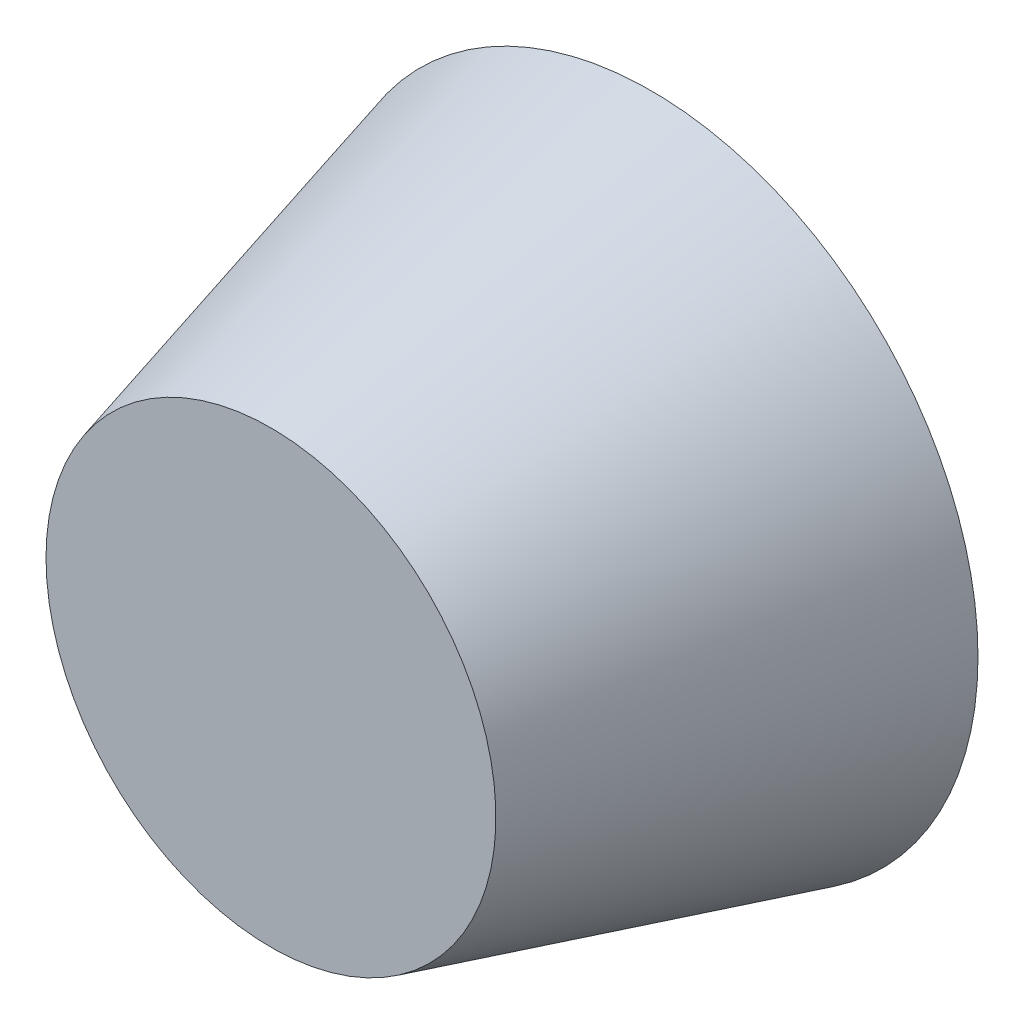
ISO-10303-21;
HEADER;
FILE_DESCRIPTION(('STEP AP214'),'2;1');
FILE_NAME('part.step','',(''),(''),'','','');
FILE_SCHEMA(('AUTOMOTIVE_DESIGN { 1 0 10303 214 1 1 1 1 }'));
ENDSEC;
DATA;
#1=APPLICATION_CONTEXT('core data for automotive mechanical design processes');
#2=APPLICATION_PROTOCOL_DEFINITION('international standard','automotive_design',2000,#1);
#3=PRODUCT_CONTEXT('',#1,'mechanical');
#4=PRODUCT('Part','Part','',(#3));
#5=PRODUCT_RELATED_PRODUCT_CATEGORY('part','',(#4));
#6=PRODUCT_DEFINITION_FORMATION('','',#4);
#7=PRODUCT_DEFINITION_CONTEXT('part definition',#1,'design');
#8=PRODUCT_DEFINITION('design','',#6,#7);
#9=PRODUCT_DEFINITION_SHAPE('','',#8);
#10=(LENGTH_UNIT() NAMED_UNIT(*) SI_UNIT(.MILLI.,.METRE.));
#11=(NAMED_UNIT(*) PLANE_ANGLE_UNIT() SI_UNIT($,.RADIAN.));
#12=(NAMED_UNIT(*) SI_UNIT($,.STERADIAN.) SOLID_ANGLE_UNIT());
#13=UNCERTAINTY_MEASURE_WITH_UNIT(LENGTH_MEASURE(1.E-05),#10,'distance_accuracy_value','');
#14=(GEOMETRIC_REPRESENTATION_CONTEXT(3) GLOBAL_UNCERTAINTY_ASSIGNED_CONTEXT((#13)) GLOBAL_UNIT_ASSIGNED_CONTEXT((#10,
#11,#12)) REPRESENTATION_CONTEXT('',''));
#15=CARTESIAN_POINT('',(0.,0.,0.));
#16=DIRECTION('',(0.,0.,1.));
#17=DIRECTION('',(1.,0.,0.));
#18=AXIS2_PLACEMENT_3D('',#15,#16,#17);
#19=CARTESIAN_POINT('',(0.,0.,0.));
#20=DIRECTION('',(0.,0.,-1.));
#21=DIRECTION('',(-1.,0.,0.));
#22=AXIS2_PLACEMENT_3D('',#19,#20,#21);
#23=PLANE('',#22);
#24=CARTESIAN_POINT('',(0.,0.,0.));
#25=DIRECTION('',(0.,0.,-1.));
#26=DIRECTION('',(-1.,0.,0.));
#27=AXIS2_PLACEMENT_3D('',#24,#25,#26);
#28=CIRCLE('',#27,40.);
#29=CARTESIAN_POINT('',(-40.,0.,0.));
#30=VERTEX_POINT('',#29);
#31=EDGE_CURVE('E10',#30,#30,#28,.T.);
#32=ORIENTED_EDGE('',*,*,#31,.F.);
#33=EDGE_LOOP('',(#32));
#34=FACE_BOUND('',#33,.T.);
#35=ADVANCED_FACE('F33',(#34),#23,.F.);
#36=CARTESIAN_POINT('',(0.,0.,0.));
#37=DIRECTION('',(0.,0.,-1.));
#38=DIRECTION('',(-1.,0.,0.));
#39=AXIS2_PLACEMENT_3D('',#36,#37,#38);
#40=CONICAL_SURFACE('',#39,40.,0.261799387799145);
#41=CARTESIAN_POINT('',(0.,0.,-67.6148078402349));
#42=DIRECTION('',(0.,0.,-1.));
#43=DIRECTION('',(-1.,0.,0.));
#44=AXIS2_PLACEMENT_3D('',#41,#42,#43);
#45=CIRCLE('',#44,58.1173331571762);
#46=CARTESIAN_POINT('',(-58.1173331571762,0.,-67.6148078402349));
#47=VERTEX_POINT('',#46);
#48=EDGE_CURVE('E39',#47,#47,#45,.T.);
#49=ORIENTED_EDGE('',*,*,#48,.F.);
#50=EDGE_LOOP('',(#49));
#51=FACE_BOUND('',#50,.T.);
#52=ORIENTED_EDGE('',*,*,#31,.T.);
#53=EDGE_LOOP('',(#52));
#54=FACE_BOUND('',#53,.T.);
#55=ADVANCED_FACE('F63',(#51,#54),#40,.T.);
#56=CARTESIAN_POINT('',(58.1173331571762,0.,-67.6148078402348));
#57=DIRECTION('',(0.,0.,1.));
#58=DIRECTION('',(1.,0.,0.));
#59=AXIS2_PLACEMENT_3D('',#56,#57,#58);
#60=PLANE('',#59);
#61=CARTESIAN_POINT('',(0.,0.,-67.6148078402349));
#62=DIRECTION('',(0.,0.,-1.));
#63=DIRECTION('',(-1.,0.,0.));
#64=AXIS2_PLACEMENT_3D('',#61,#62,#63);
#65=CIRCLE('',#64,55.1173331571762);
#66=CARTESIAN_POINT('',(-55.1173331571761,0.,-67.6148078402349));
#67=VERTEX_POINT('',#66);
#68=EDGE_CURVE('E43',#67,#67,#65,.T.);
#69=ORIENTED_EDGE('',*,*,#68,.F.);
#70=EDGE_LOOP('',(#69));
#71=FACE_BOUND('',#70,.T.);
#72=ORIENTED_EDGE('',*,*,#48,.T.);
#73=EDGE_LOOP('',(#72));
#74=FACE_BOUND('',#73,.T.);
#75=ADVANCED_FACE('F58',(#71,#74),#60,.F.);
#76=CARTESIAN_POINT('',(0.,0.,-67.6148078402349));
#77=DIRECTION('',(0.,0.,-1.));
#78=DIRECTION('',(-1.,0.,0.));
#79=AXIS2_PLACEMENT_3D('',#76,#77,#78);
#80=CONICAL_SURFACE('',#79,55.1173331571762,0.261799387799146);
#81=CARTESIAN_POINT('',(0.,0.,-3.00000000000002));
#82=DIRECTION('',(0.,0.,-1.));
#83=DIRECTION('',(-1.,0.,0.));
#84=AXIS2_PLACEMENT_3D('',#81,#82,#83);
#85=CIRCLE('',#84,37.8038475772933);
#86=CARTESIAN_POINT('',(-37.8038475772933,0.,-3.00000000000004));
#87=VERTEX_POINT('',#86);
#88=EDGE_CURVE('E47',#87,#87,#85,.T.);
#89=ORIENTED_EDGE('',*,*,#88,.F.);
#90=EDGE_LOOP('',(#89));
#91=FACE_BOUND('',#90,.T.);
#92=ORIENTED_EDGE('',*,*,#68,.T.);
#93=EDGE_LOOP('',(#92));
#94=FACE_BOUND('',#93,.T.);
#95=ADVANCED_FACE('F55',(#91,#94),#80,.F.);
#96=CARTESIAN_POINT('',(37.8038475772933,0.,-2.99999999999999));
#97=DIRECTION('',(0.,0.,1.));
#98=DIRECTION('',(1.,0.,0.));
#99=AXIS2_PLACEMENT_3D('',#96,#97,#98);
#100=PLANE('',#99);
#101=ORIENTED_EDGE('',*,*,#88,.T.);
#102=EDGE_LOOP('',(#101));
#103=FACE_BOUND('',#102,.T.);
#104=ADVANCED_FACE('F53',(#103),#100,.F.);
#105=CLOSED_SHELL('',(#35,#55,#75,#95,#104));
#106=MANIFOLD_SOLID_BREP('B2',#105);
#107=ADVANCED_BREP_SHAPE_REPRESENTATION('',(#18,#106),#14);
#108=SHAPE_DEFINITION_REPRESENTATION(#9,#107);
ENDSEC;
END-ISO-10303-21;
